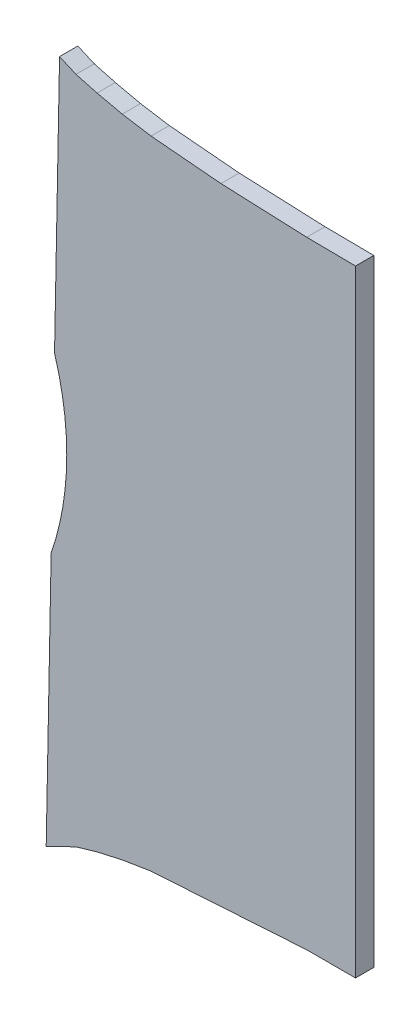
ISO-10303-21;
HEADER;
FILE_DESCRIPTION(('STEP AP214'),'2;1');
FILE_NAME('part.step','',(''),(''),'','','');
FILE_SCHEMA(('AUTOMOTIVE_DESIGN { 1 0 10303 214 1 1 1 1 }'));
ENDSEC;
DATA;
#1=APPLICATION_CONTEXT('core data for automotive mechanical design processes');
#2=APPLICATION_PROTOCOL_DEFINITION('international standard','automotive_design',2000,#1);
#3=PRODUCT_CONTEXT('',#1,'mechanical');
#4=PRODUCT('Part','Part','',(#3));
#5=PRODUCT_RELATED_PRODUCT_CATEGORY('part','',(#4));
#6=PRODUCT_DEFINITION_FORMATION('','',#4);
#7=PRODUCT_DEFINITION_CONTEXT('part definition',#1,'design');
#8=PRODUCT_DEFINITION('design','',#6,#7);
#9=PRODUCT_DEFINITION_SHAPE('','',#8);
#10=(LENGTH_UNIT() NAMED_UNIT(*) SI_UNIT(.MILLI.,.METRE.));
#11=(NAMED_UNIT(*) PLANE_ANGLE_UNIT() SI_UNIT($,.RADIAN.));
#12=(NAMED_UNIT(*) SI_UNIT($,.STERADIAN.) SOLID_ANGLE_UNIT());
#13=UNCERTAINTY_MEASURE_WITH_UNIT(LENGTH_MEASURE(1.E-05),#10,'distance_accuracy_value','');
#14=(GEOMETRIC_REPRESENTATION_CONTEXT(3) GLOBAL_UNCERTAINTY_ASSIGNED_CONTEXT((#13)) GLOBAL_UNIT_ASSIGNED_CONTEXT((#10,
#11,#12)) REPRESENTATION_CONTEXT('',''));
#15=CARTESIAN_POINT('',(0.,0.,0.));
#16=DIRECTION('',(0.,0.,1.));
#17=DIRECTION('',(1.,0.,0.));
#18=AXIS2_PLACEMENT_3D('',#15,#16,#17);
#19=CARTESIAN_POINT('',(86.8539962768555,56.6870002746582,0.));
#20=DIRECTION('',(-1.,0.,0.));
#21=DIRECTION('',(0.,1.,0.));
#22=AXIS2_PLACEMENT_3D('',#19,#20,#21);
#23=PLANE('',#22);
#24=DIRECTION('',(0.,1.,0.));
#25=VECTOR('',#24,1.);
#26=CARTESIAN_POINT('',(86.8539962768555,56.6870002746582,0.03556));
#27=LINE('',#26,#25);
#28=CARTESIAN_POINT('',(86.8539962768555,56.6870002746582,0.03556));
#29=VERTEX_POINT('',#28);
#30=CARTESIAN_POINT('',(86.8539962768555,57.8870010375977,0.03556));
#31=VERTEX_POINT('',#30);
#32=EDGE_CURVE('E11',#29,#31,#27,.T.);
#33=ORIENTED_EDGE('',*,*,#32,.F.);
#34=DIRECTION('',(0.,0.,1.));
#35=VECTOR('',#34,1.);
#36=CARTESIAN_POINT('',(86.8539962768555,56.6870002746582,0.));
#37=LINE('',#36,#35);
#38=CARTESIAN_POINT('',(86.8539962768555,56.6870002746582,0.));
#39=VERTEX_POINT('',#38);
#40=EDGE_CURVE('E24',#39,#29,#37,.T.);
#41=ORIENTED_EDGE('',*,*,#40,.F.);
#42=DIRECTION('',(0.,1.,0.));
#43=VECTOR('',#42,1.);
#44=CARTESIAN_POINT('',(86.8539962768555,56.6870002746582,0.));
#45=LINE('',#44,#43);
#46=CARTESIAN_POINT('',(86.8539962768555,57.8870010375977,0.));
#47=VERTEX_POINT('',#46);
#48=EDGE_CURVE('E281',#39,#47,#45,.T.);
#49=ORIENTED_EDGE('',*,*,#48,.T.);
#50=DIRECTION('',(0.,0.,1.));
#51=VECTOR('',#50,1.);
#52=CARTESIAN_POINT('',(86.8539962768555,57.8870010375977,0.));
#53=LINE('',#52,#51);
#54=EDGE_CURVE('E37',#47,#31,#53,.T.);
#55=ORIENTED_EDGE('',*,*,#54,.T.);
#56=EDGE_LOOP('',(#33,#41,#49,#55));
#57=FACE_BOUND('',#56,.T.);
#58=ADVANCED_FACE('F17',(#57),#23,.F.);
#59=CARTESIAN_POINT('',(86.7590026855469,56.6870002746582,0.));
#60=DIRECTION('',(0.,1.,0.));
#61=DIRECTION('',(1.,0.,0.));
#62=AXIS2_PLACEMENT_3D('',#59,#60,#61);
#63=PLANE('',#62);
#64=DIRECTION('',(1.,0.,0.));
#65=VECTOR('',#64,1.);
#66=CARTESIAN_POINT('',(86.7590026855469,56.6870002746582,0.03556));
#67=LINE('',#66,#65);
#68=CARTESIAN_POINT('',(86.7590026855469,56.6870002746582,0.03556));
#69=VERTEX_POINT('',#68);
#70=EDGE_CURVE('E277',#69,#29,#67,.T.);
#71=ORIENTED_EDGE('',*,*,#70,.F.);
#72=DIRECTION('',(0.,0.,1.));
#73=VECTOR('',#72,1.);
#74=CARTESIAN_POINT('',(86.7590026855469,56.6870002746582,0.));
#75=LINE('',#74,#73);
#76=CARTESIAN_POINT('',(86.7590026855469,56.6870002746582,0.));
#77=VERTEX_POINT('',#76);
#78=EDGE_CURVE('E275',#77,#69,#75,.T.);
#79=ORIENTED_EDGE('',*,*,#78,.F.);
#80=DIRECTION('',(1.,0.,0.));
#81=VECTOR('',#80,1.);
#82=CARTESIAN_POINT('',(86.7590026855469,56.6870002746582,0.));
#83=LINE('',#82,#81);
#84=EDGE_CURVE('E273',#77,#39,#83,.T.);
#85=ORIENTED_EDGE('',*,*,#84,.T.);
#86=ORIENTED_EDGE('',*,*,#40,.T.);
#87=EDGE_LOOP('',(#71,#79,#85,#86));
#88=FACE_BOUND('',#87,.T.);
#89=ADVANCED_FACE('F284',(#88),#63,.F.);
#90=CARTESIAN_POINT('',(86.4560012817383,56.6679992675781,0.));
#91=DIRECTION('',(-0.0625863654447241,0.998039551751542,0.));
#92=DIRECTION('',(0.998039551751542,0.0625863654447241,0.));
#93=AXIS2_PLACEMENT_3D('',#90,#91,#92);
#94=PLANE('',#93);
#95=DIRECTION('',(0.998039551751542,0.062586365444724,0.));
#96=VECTOR('',#95,1.);
#97=CARTESIAN_POINT('',(86.4560012817383,56.6679992675781,0.03556));
#98=LINE('',#97,#96);
#99=CARTESIAN_POINT('',(86.4560012817383,56.6679992675781,0.03556));
#100=VERTEX_POINT('',#99);
#101=EDGE_CURVE('E270',#100,#69,#98,.T.);
#102=ORIENTED_EDGE('',*,*,#101,.F.);
#103=DIRECTION('',(0.,0.,1.));
#104=VECTOR('',#103,1.);
#105=CARTESIAN_POINT('',(86.4560012817383,56.6679992675781,0.));
#106=LINE('',#105,#104);
#107=CARTESIAN_POINT('',(86.4560012817383,56.6679992675781,0.));
#108=VERTEX_POINT('',#107);
#109=EDGE_CURVE('E268',#108,#100,#106,.T.);
#110=ORIENTED_EDGE('',*,*,#109,.F.);
#111=DIRECTION('',(0.998039551751542,0.062586365444724,0.));
#112=VECTOR('',#111,1.);
#113=CARTESIAN_POINT('',(86.4560012817383,56.6679992675781,0.));
#114=LINE('',#113,#112);
#115=EDGE_CURVE('E265',#108,#77,#114,.T.);
#116=ORIENTED_EDGE('',*,*,#115,.T.);
#117=ORIENTED_EDGE('',*,*,#78,.T.);
#118=EDGE_LOOP('',(#102,#110,#116,#117));
#119=FACE_BOUND('',#118,.T.);
#120=ADVANCED_FACE('F287',(#119),#94,.F.);
#121=CARTESIAN_POINT('',(86.4000015258789,56.6590003967285,0.));
#122=DIRECTION('',(-0.158659362899509,0.98733338167223,0.));
#123=DIRECTION('',(0.98733338167223,0.158659362899509,0.));
#124=AXIS2_PLACEMENT_3D('',#121,#122,#123);
#125=PLANE('',#124);
#126=DIRECTION('',(0.98733338167223,0.158659362899509,0.));
#127=VECTOR('',#126,1.);
#128=CARTESIAN_POINT('',(86.4000015258789,56.6590003967285,0.03556));
#129=LINE('',#128,#127);
#130=CARTESIAN_POINT('',(86.4000015258789,56.6590003967285,0.03556));
#131=VERTEX_POINT('',#130);
#132=EDGE_CURVE('E262',#131,#100,#129,.T.);
#133=ORIENTED_EDGE('',*,*,#132,.F.);
#134=DIRECTION('',(0.,0.,1.));
#135=VECTOR('',#134,1.);
#136=CARTESIAN_POINT('',(86.4000015258789,56.6590003967285,0.));
#137=LINE('',#136,#135);
#138=CARTESIAN_POINT('',(86.4000015258789,56.6590003967285,0.));
#139=VERTEX_POINT('',#138);
#140=EDGE_CURVE('E260',#139,#131,#137,.T.);
#141=ORIENTED_EDGE('',*,*,#140,.F.);
#142=DIRECTION('',(0.98733338167223,0.158659362899509,0.));
#143=VECTOR('',#142,1.);
#144=CARTESIAN_POINT('',(86.4000015258789,56.6590003967285,0.));
#145=LINE('',#144,#143);
#146=EDGE_CURVE('E257',#139,#108,#145,.T.);
#147=ORIENTED_EDGE('',*,*,#146,.T.);
#148=ORIENTED_EDGE('',*,*,#109,.T.);
#149=EDGE_LOOP('',(#133,#141,#147,#148));
#150=FACE_BOUND('',#149,.T.);
#151=ADVANCED_FACE('F292',(#150),#125,.F.);
#152=CARTESIAN_POINT('',(86.3509979248047,56.6479988098145,0.));
#153=DIRECTION('',(-0.219053099521805,0.975712939132146,0.));
#154=DIRECTION('',(0.975712939132146,0.219053099521805,0.));
#155=AXIS2_PLACEMENT_3D('',#152,#153,#154);
#156=PLANE('',#155);
#157=DIRECTION('',(0.975712939132146,0.219053099521805,0.));
#158=VECTOR('',#157,1.);
#159=CARTESIAN_POINT('',(86.3509979248047,56.6479988098145,0.03556));
#160=LINE('',#159,#158);
#161=CARTESIAN_POINT('',(86.3509979248047,56.6479988098145,0.03556));
#162=VERTEX_POINT('',#161);
#163=EDGE_CURVE('E254',#162,#131,#160,.T.);
#164=ORIENTED_EDGE('',*,*,#163,.F.);
#165=DIRECTION('',(0.,0.,1.));
#166=VECTOR('',#165,1.);
#167=CARTESIAN_POINT('',(86.3509979248047,56.6479988098145,0.));
#168=LINE('',#167,#166);
#169=CARTESIAN_POINT('',(86.3509979248047,56.6479988098145,0.));
#170=VERTEX_POINT('',#169);
#171=EDGE_CURVE('E252',#170,#162,#168,.T.);
#172=ORIENTED_EDGE('',*,*,#171,.F.);
#173=DIRECTION('',(0.975712939132146,0.219053099521805,0.));
#174=VECTOR('',#173,1.);
#175=CARTESIAN_POINT('',(86.3509979248047,56.6479988098145,0.));
#176=LINE('',#175,#174);
#177=EDGE_CURVE('E249',#170,#139,#176,.T.);
#178=ORIENTED_EDGE('',*,*,#177,.T.);
#179=ORIENTED_EDGE('',*,*,#140,.T.);
#180=EDGE_LOOP('',(#164,#172,#178,#179));
#181=FACE_BOUND('',#180,.T.);
#182=ADVANCED_FACE('F295',(#181),#156,.F.);
#183=CARTESIAN_POINT('',(86.3099975585938,56.6360015869141,0.));
#184=DIRECTION('',(-0.280836563379069,0.959755606740296,0.));
#185=DIRECTION('',(0.959755606740296,0.280836563379069,0.));
#186=AXIS2_PLACEMENT_3D('',#183,#184,#185);
#187=PLANE('',#186);
#188=DIRECTION('',(0.959755606740296,0.280836563379069,0.));
#189=VECTOR('',#188,1.);
#190=CARTESIAN_POINT('',(86.3099975585938,56.6360015869141,0.03556));
#191=LINE('',#190,#189);
#192=CARTESIAN_POINT('',(86.3099975585938,56.6360015869141,0.03556));
#193=VERTEX_POINT('',#192);
#194=EDGE_CURVE('E246',#193,#162,#191,.T.);
#195=ORIENTED_EDGE('',*,*,#194,.F.);
#196=DIRECTION('',(0.,0.,1.));
#197=VECTOR('',#196,1.);
#198=CARTESIAN_POINT('',(86.3099975585938,56.6360015869141,0.));
#199=LINE('',#198,#197);
#200=CARTESIAN_POINT('',(86.3099975585938,56.6360015869141,0.));
#201=VERTEX_POINT('',#200);
#202=EDGE_CURVE('E244',#201,#193,#199,.T.);
#203=ORIENTED_EDGE('',*,*,#202,.F.);
#204=DIRECTION('',(0.959755606740296,0.280836563379069,0.));
#205=VECTOR('',#204,1.);
#206=CARTESIAN_POINT('',(86.3099975585938,56.6360015869141,0.));
#207=LINE('',#206,#205);
#208=EDGE_CURVE('E241',#201,#170,#207,.T.);
#209=ORIENTED_EDGE('',*,*,#208,.T.);
#210=ORIENTED_EDGE('',*,*,#171,.T.);
#211=EDGE_LOOP('',(#195,#203,#209,#210));
#212=FACE_BOUND('',#211,.T.);
#213=ADVANCED_FACE('F300',(#212),#187,.F.);
#214=CARTESIAN_POINT('',(86.2519989013672,56.6080017089844,0.));
#215=DIRECTION('',(-0.434755691468777,0.900548437750855,0.));
#216=DIRECTION('',(0.900548437750855,0.434755691468777,0.));
#217=AXIS2_PLACEMENT_3D('',#214,#215,#216);
#218=PLANE('',#217);
#219=DIRECTION('',(0.900548437750855,0.434755691468777,0.));
#220=VECTOR('',#219,1.);
#221=CARTESIAN_POINT('',(86.2519989013672,56.6080017089844,0.03556));
#222=LINE('',#221,#220);
#223=CARTESIAN_POINT('',(86.2519989013672,56.6080017089844,0.03556));
#224=VERTEX_POINT('',#223);
#225=EDGE_CURVE('E238',#224,#193,#222,.T.);
#226=ORIENTED_EDGE('',*,*,#225,.F.);
#227=DIRECTION('',(0.,0.,1.));
#228=VECTOR('',#227,1.);
#229=CARTESIAN_POINT('',(86.2519989013672,56.6080017089844,0.));
#230=LINE('',#229,#228);
#231=CARTESIAN_POINT('',(86.2519989013672,56.6080017089844,0.));
#232=VERTEX_POINT('',#231);
#233=EDGE_CURVE('E236',#232,#224,#230,.T.);
#234=ORIENTED_EDGE('',*,*,#233,.F.);
#235=DIRECTION('',(0.900548437750855,0.434755691468777,0.));
#236=VECTOR('',#235,1.);
#237=CARTESIAN_POINT('',(86.2519989013672,56.6080017089844,0.));
#238=LINE('',#237,#236);
#239=EDGE_CURVE('E233',#232,#201,#238,.T.);
#240=ORIENTED_EDGE('',*,*,#239,.T.);
#241=ORIENTED_EDGE('',*,*,#202,.T.);
#242=EDGE_LOOP('',(#226,#234,#240,#241));
#243=FACE_BOUND('',#242,.T.);
#244=ADVANCED_FACE('F303',(#243),#218,.F.);
#245=CARTESIAN_POINT('',(86.2616575630483,57.1072607087142,0.));
#246=DIRECTION('',(0.999812918767624,-0.0193423748636048,0.));
#247=DIRECTION('',(-0.0193423748636048,-0.999812918767624,0.));
#248=AXIS2_PLACEMENT_3D('',#245,#246,#247);
#249=PLANE('',#248);
#250=DIRECTION('',(-0.0193423748636048,-0.999812918767624,0.));
#251=VECTOR('',#250,1.);
#252=CARTESIAN_POINT('',(86.2779998779297,57.9519996643066,0.03556));
#253=LINE('',#252,#251);
#254=CARTESIAN_POINT('',(86.2616575630483,57.1072607087142,0.03556));
#255=VERTEX_POINT('',#254);
#256=EDGE_CURVE('E230',#255,#224,#253,.T.);
#257=ORIENTED_EDGE('',*,*,#256,.F.);
#258=DIRECTION('',(0.,0.,1.));
#259=VECTOR('',#258,1.);
#260=CARTESIAN_POINT('',(86.2616575630483,57.1072607087142,0.));
#261=LINE('',#260,#259);
#262=CARTESIAN_POINT('',(86.2616575630483,57.1072607087142,0.));
#263=VERTEX_POINT('',#262);
#264=EDGE_CURVE('E228',#263,#255,#261,.T.);
#265=ORIENTED_EDGE('',*,*,#264,.F.);
#266=DIRECTION('',(-0.0193423748636048,-0.999812918767624,0.));
#267=VECTOR('',#266,1.);
#268=CARTESIAN_POINT('',(86.2779998779297,57.9519996643066,0.));
#269=LINE('',#268,#267);
#270=EDGE_CURVE('E225',#263,#232,#269,.T.);
#271=ORIENTED_EDGE('',*,*,#270,.T.);
#272=ORIENTED_EDGE('',*,*,#233,.T.);
#273=EDGE_LOOP('',(#257,#265,#271,#272));
#274=FACE_BOUND('',#273,.T.);
#275=ADVANCED_FACE('F308',(#274),#249,.F.);
#276=CARTESIAN_POINT('',(85.742018,57.2874648,0.));
#277=DIRECTION('',(0.,0.,-1.));
#278=DIRECTION('',(1.,0.,0.));
#279=AXIS2_PLACEMENT_3D('',#276,#277,#278);
#280=CYLINDRICAL_SURFACE('',#279,0.5499989);
#281=ORIENTED_EDGE('',*,*,#264,.T.);
#282=CARTESIAN_POINT('',(85.742018,57.2874648,0.03556));
#283=DIRECTION('',(0.,0.,1.));
#284=DIRECTION('',(1.,0.,0.));
#285=AXIS2_PLACEMENT_3D('',#282,#283,#284);
#286=CIRCLE('',#285,0.5499989);
#287=CARTESIAN_POINT('',(86.2920169,57.2874648,0.03556));
#288=VERTEX_POINT('',#287);
#289=EDGE_CURVE('E222',#255,#288,#286,.T.);
#290=ORIENTED_EDGE('',*,*,#289,.T.);
#291=DIRECTION('',(0.,0.,1.));
#292=VECTOR('',#291,1.);
#293=CARTESIAN_POINT('',(86.2920169,57.2874648,0.));
#294=LINE('',#293,#292);
#295=CARTESIAN_POINT('',(86.2920169,57.2874648,0.));
#296=VERTEX_POINT('',#295);
#297=EDGE_CURVE('E220',#296,#288,#294,.T.);
#298=ORIENTED_EDGE('',*,*,#297,.F.);
#299=CARTESIAN_POINT('',(85.742018,57.2874648,0.));
#300=DIRECTION('',(0.,0.,1.));
#301=DIRECTION('',(1.,0.,0.));
#302=AXIS2_PLACEMENT_3D('',#299,#300,#301);
#303=CIRCLE('',#302,0.5499989);
#304=EDGE_CURVE('E217',#263,#296,#303,.T.);
#305=ORIENTED_EDGE('',*,*,#304,.F.);
#306=EDGE_LOOP('',(#281,#290,#298,#305));
#307=FACE_BOUND('',#306,.T.);
#308=ADVANCED_FACE('F311',(#307),#280,.F.);
#309=CARTESIAN_POINT('',(85.742018,57.2874648,0.));
#310=DIRECTION('',(0.,0.,-1.));
#311=DIRECTION('',(1.,0.,0.));
#312=AXIS2_PLACEMENT_3D('',#309,#310,#311);
#313=CYLINDRICAL_SURFACE('',#312,0.5499989);
#314=ORIENTED_EDGE('',*,*,#297,.T.);
#315=CARTESIAN_POINT('',(85.742018,57.2874648,0.03556));
#316=DIRECTION('',(0.,0.,1.));
#317=DIRECTION('',(1.,0.,0.));
#318=AXIS2_PLACEMENT_3D('',#315,#316,#317);
#319=CIRCLE('',#318,0.5499989);
#320=CARTESIAN_POINT('',(86.2682385861829,57.4474356869717,0.03556));
#321=VERTEX_POINT('',#320);
#322=EDGE_CURVE('E214',#288,#321,#319,.T.);
#323=ORIENTED_EDGE('',*,*,#322,.T.);
#324=DIRECTION('',(0.,0.,1.));
#325=VECTOR('',#324,1.);
#326=CARTESIAN_POINT('',(86.2682385861829,57.4474356869717,0.));
#327=LINE('',#326,#325);
#328=CARTESIAN_POINT('',(86.2682385861829,57.4474356869717,0.));
#329=VERTEX_POINT('',#328);
#330=EDGE_CURVE('E212',#329,#321,#327,.T.);
#331=ORIENTED_EDGE('',*,*,#330,.F.);
#332=EDGE_CURVE('E211',#296,#329,#303,.T.);
#333=ORIENTED_EDGE('',*,*,#332,.F.);
#334=EDGE_LOOP('',(#314,#323,#331,#333));
#335=FACE_BOUND('',#334,.T.);
#336=ADVANCED_FACE('F318',(#335),#313,.F.);
#337=CARTESIAN_POINT('',(86.2779998779297,57.9519996643066,0.));
#338=DIRECTION('',(0.999812918767624,-0.0193423748636048,0.));
#339=DIRECTION('',(-0.0193423748636048,-0.999812918767624,0.));
#340=AXIS2_PLACEMENT_3D('',#337,#338,#339);
#341=PLANE('',#340);
#342=DIRECTION('',(-0.0193423748636048,-0.999812918767624,0.));
#343=VECTOR('',#342,1.);
#344=CARTESIAN_POINT('',(86.2779998779297,57.9519996643066,0.03556));
#345=LINE('',#344,#343);
#346=CARTESIAN_POINT('',(86.2779998779297,57.9519996643066,0.03556));
#347=VERTEX_POINT('',#346);
#348=EDGE_CURVE('E208',#347,#321,#345,.T.);
#349=ORIENTED_EDGE('',*,*,#348,.F.);
#350=DIRECTION('',(0.,0.,1.));
#351=VECTOR('',#350,1.);
#352=CARTESIAN_POINT('',(86.2779998779297,57.9519996643066,0.));
#353=LINE('',#352,#351);
#354=CARTESIAN_POINT('',(86.2779998779297,57.9519996643066,0.));
#355=VERTEX_POINT('',#354);
#356=EDGE_CURVE('E206',#355,#347,#353,.T.);
#357=ORIENTED_EDGE('',*,*,#356,.F.);
#358=EDGE_CURVE('E205',#355,#329,#269,.T.);
#359=ORIENTED_EDGE('',*,*,#358,.T.);
#360=ORIENTED_EDGE('',*,*,#330,.T.);
#361=EDGE_LOOP('',(#349,#357,#359,#360));
#362=FACE_BOUND('',#361,.T.);
#363=ADVANCED_FACE('F321',(#362),#341,.F.);
#364=CARTESIAN_POINT('',(86.3099975585938,57.9379997253418,0.));
#365=DIRECTION('',(-0.400841752438229,-0.916147307752552,0.));
#366=DIRECTION('',(-0.916147307752552,0.400841752438229,0.));
#367=AXIS2_PLACEMENT_3D('',#364,#365,#366);
#368=PLANE('',#367);
#369=DIRECTION('',(-0.916147307752552,0.400841752438229,0.));
#370=VECTOR('',#369,1.);
#371=CARTESIAN_POINT('',(86.3099975585938,57.9379997253418,0.03556));
#372=LINE('',#371,#370);
#373=CARTESIAN_POINT('',(86.3099975585938,57.9379997253418,0.03556));
#374=VERTEX_POINT('',#373);
#375=EDGE_CURVE('E202',#374,#347,#372,.T.);
#376=ORIENTED_EDGE('',*,*,#375,.F.);
#377=DIRECTION('',(0.,0.,1.));
#378=VECTOR('',#377,1.);
#379=CARTESIAN_POINT('',(86.3099975585938,57.9379997253418,0.));
#380=LINE('',#379,#378);
#381=CARTESIAN_POINT('',(86.3099975585938,57.9379997253418,0.));
#382=VERTEX_POINT('',#381);
#383=EDGE_CURVE('E200',#382,#374,#380,.T.);
#384=ORIENTED_EDGE('',*,*,#383,.F.);
#385=DIRECTION('',(-0.916147307752552,0.400841752438229,0.));
#386=VECTOR('',#385,1.);
#387=CARTESIAN_POINT('',(86.3099975585938,57.9379997253418,0.));
#388=LINE('',#387,#386);
#389=EDGE_CURVE('E197',#382,#355,#388,.T.);
#390=ORIENTED_EDGE('',*,*,#389,.T.);
#391=ORIENTED_EDGE('',*,*,#356,.T.);
#392=EDGE_LOOP('',(#376,#384,#390,#391));
#393=FACE_BOUND('',#392,.T.);
#394=ADVANCED_FACE('F326',(#393),#368,.F.);
#395=CARTESIAN_POINT('',(86.3509979248047,57.9269981384277,0.));
#396=DIRECTION('',(-0.259161279205212,-0.96583405995063,0.));
#397=DIRECTION('',(-0.96583405995063,0.259161279205212,0.));
#398=AXIS2_PLACEMENT_3D('',#395,#396,#397);
#399=PLANE('',#398);
#400=DIRECTION('',(-0.96583405995063,0.259161279205212,0.));
#401=VECTOR('',#400,1.);
#402=CARTESIAN_POINT('',(86.3509979248047,57.9269981384277,0.03556));
#403=LINE('',#402,#401);
#404=CARTESIAN_POINT('',(86.3509979248047,57.9269981384277,0.03556));
#405=VERTEX_POINT('',#404);
#406=EDGE_CURVE('E194',#405,#374,#403,.T.);
#407=ORIENTED_EDGE('',*,*,#406,.F.);
#408=DIRECTION('',(0.,0.,1.));
#409=VECTOR('',#408,1.);
#410=CARTESIAN_POINT('',(86.3509979248047,57.9269981384277,0.));
#411=LINE('',#410,#409);
#412=CARTESIAN_POINT('',(86.3509979248047,57.9269981384277,0.));
#413=VERTEX_POINT('',#412);
#414=EDGE_CURVE('E192',#413,#405,#411,.T.);
#415=ORIENTED_EDGE('',*,*,#414,.F.);
#416=DIRECTION('',(-0.96583405995063,0.259161279205212,0.));
#417=VECTOR('',#416,1.);
#418=CARTESIAN_POINT('',(86.3509979248047,57.9269981384277,0.));
#419=LINE('',#418,#417);
#420=EDGE_CURVE('E189',#413,#382,#419,.T.);
#421=ORIENTED_EDGE('',*,*,#420,.T.);
#422=ORIENTED_EDGE('',*,*,#383,.T.);
#423=EDGE_LOOP('',(#407,#415,#421,#422));
#424=FACE_BOUND('',#423,.T.);
#425=ADVANCED_FACE('F329',(#424),#399,.F.);
#426=CARTESIAN_POINT('',(86.4000015258789,57.9160003662109,0.));
#427=DIRECTION('',(-0.218980787731685,-0.975729170725366,0.));
#428=DIRECTION('',(-0.975729170725366,0.218980787731685,0.));
#429=AXIS2_PLACEMENT_3D('',#426,#427,#428);
#430=PLANE('',#429);
#431=DIRECTION('',(-0.975729170725366,0.218980787731685,0.));
#432=VECTOR('',#431,1.);
#433=CARTESIAN_POINT('',(86.4000015258789,57.9160003662109,0.03556));
#434=LINE('',#433,#432);
#435=CARTESIAN_POINT('',(86.4000015258789,57.9160003662109,0.03556));
#436=VERTEX_POINT('',#435);
#437=EDGE_CURVE('E186',#436,#405,#434,.T.);
#438=ORIENTED_EDGE('',*,*,#437,.F.);
#439=DIRECTION('',(0.,0.,1.));
#440=VECTOR('',#439,1.);
#441=CARTESIAN_POINT('',(86.4000015258789,57.9160003662109,0.));
#442=LINE('',#441,#440);
#443=CARTESIAN_POINT('',(86.4000015258789,57.9160003662109,0.));
#444=VERTEX_POINT('',#443);
#445=EDGE_CURVE('E184',#444,#436,#442,.T.);
#446=ORIENTED_EDGE('',*,*,#445,.F.);
#447=DIRECTION('',(-0.975729170725366,0.218980787731685,0.));
#448=VECTOR('',#447,1.);
#449=CARTESIAN_POINT('',(86.4000015258789,57.9160003662109,0.));
#450=LINE('',#449,#448);
#451=EDGE_CURVE('E181',#444,#413,#450,.T.);
#452=ORIENTED_EDGE('',*,*,#451,.T.);
#453=ORIENTED_EDGE('',*,*,#414,.T.);
#454=EDGE_LOOP('',(#438,#446,#452,#453));
#455=FACE_BOUND('',#454,.T.);
#456=ADVANCED_FACE('F333',(#455),#430,.F.);
#457=CARTESIAN_POINT('',(86.4560012817383,57.9070014953613,0.));
#458=DIRECTION('',(-0.158659362899509,-0.98733338167223,0.));
#459=DIRECTION('',(-0.98733338167223,0.158659362899509,0.));
#460=AXIS2_PLACEMENT_3D('',#457,#458,#459);
#461=PLANE('',#460);
#462=DIRECTION('',(-0.98733338167223,0.158659362899509,0.));
#463=VECTOR('',#462,1.);
#464=CARTESIAN_POINT('',(86.4560012817383,57.9070014953613,0.03556));
#465=LINE('',#464,#463);
#466=CARTESIAN_POINT('',(86.4560012817383,57.9070014953613,0.03556));
#467=VERTEX_POINT('',#466);
#468=EDGE_CURVE('E178',#467,#436,#465,.T.);
#469=ORIENTED_EDGE('',*,*,#468,.F.);
#470=DIRECTION('',(0.,0.,1.));
#471=VECTOR('',#470,1.);
#472=CARTESIAN_POINT('',(86.4560012817383,57.9070014953613,0.));
#473=LINE('',#472,#471);
#474=CARTESIAN_POINT('',(86.4560012817383,57.9070014953613,0.));
#475=VERTEX_POINT('',#474);
#476=EDGE_CURVE('E176',#475,#467,#473,.T.);
#477=ORIENTED_EDGE('',*,*,#476,.F.);
#478=DIRECTION('',(-0.98733338167223,0.158659362899509,0.));
#479=VECTOR('',#478,1.);
#480=CARTESIAN_POINT('',(86.4560012817383,57.9070014953613,0.));
#481=LINE('',#480,#479);
#482=EDGE_CURVE('E173',#475,#444,#481,.T.);
#483=ORIENTED_EDGE('',*,*,#482,.T.);
#484=ORIENTED_EDGE('',*,*,#445,.T.);
#485=EDGE_LOOP('',(#469,#477,#483,#484));
#486=FACE_BOUND('',#485,.T.);
#487=ADVANCED_FACE('F336',(#486),#461,.F.);
#488=CARTESIAN_POINT('',(86.5920028686523,57.8950004577637,0.));
#489=DIRECTION('',(-0.0879003337061126,-0.996129274408876,0.));
#490=DIRECTION('',(-0.996129274408876,0.0879003337061126,0.));
#491=AXIS2_PLACEMENT_3D('',#488,#489,#490);
#492=PLANE('',#491);
#493=DIRECTION('',(-0.996129274408876,0.0879003337061126,0.));
#494=VECTOR('',#493,1.);
#495=CARTESIAN_POINT('',(86.5920028686523,57.8950004577637,0.03556));
#496=LINE('',#495,#494);
#497=CARTESIAN_POINT('',(86.5920028686523,57.8950004577637,0.03556));
#498=VERTEX_POINT('',#497);
#499=EDGE_CURVE('E170',#498,#467,#496,.T.);
#500=ORIENTED_EDGE('',*,*,#499,.F.);
#501=DIRECTION('',(0.,0.,1.));
#502=VECTOR('',#501,1.);
#503=CARTESIAN_POINT('',(86.5920028686523,57.8950004577637,0.));
#504=LINE('',#503,#502);
#505=CARTESIAN_POINT('',(86.5920028686523,57.8950004577637,0.));
#506=VERTEX_POINT('',#505);
#507=EDGE_CURVE('E168',#506,#498,#504,.T.);
#508=ORIENTED_EDGE('',*,*,#507,.F.);
#509=DIRECTION('',(-0.996129274408876,0.0879003337061126,0.));
#510=VECTOR('',#509,1.);
#511=CARTESIAN_POINT('',(86.5920028686523,57.8950004577637,0.));
#512=LINE('',#511,#510);
#513=EDGE_CURVE('E159',#506,#475,#512,.T.);
#514=ORIENTED_EDGE('',*,*,#513,.T.);
#515=ORIENTED_EDGE('',*,*,#476,.T.);
#516=EDGE_LOOP('',(#500,#508,#514,#515));
#517=FACE_BOUND('',#516,.T.);
#518=ADVANCED_FACE('F339',(#517),#492,.F.);
#519=CARTESIAN_POINT('',(86.7590026855469,57.8880004882812,0.));
#520=DIRECTION('',(-0.0418792570717929,-0.999122679067548,0.));
#521=DIRECTION('',(-0.999122679067548,0.0418792570717929,0.));
#522=AXIS2_PLACEMENT_3D('',#519,#520,#521);
#523=PLANE('',#522);
#524=DIRECTION('',(-0.999122679067548,0.0418792570717929,0.));
#525=VECTOR('',#524,1.);
#526=CARTESIAN_POINT('',(86.7590026855469,57.8880004882812,0.03556));
#527=LINE('',#526,#525);
#528=CARTESIAN_POINT('',(86.7590026855469,57.8880004882812,0.03556));
#529=VERTEX_POINT('',#528);
#530=EDGE_CURVE('E145',#529,#498,#527,.T.);
#531=ORIENTED_EDGE('',*,*,#530,.F.);
#532=DIRECTION('',(0.,0.,1.));
#533=VECTOR('',#532,1.);
#534=CARTESIAN_POINT('',(86.7590026855469,57.8880004882812,0.));
#535=LINE('',#534,#533);
#536=CARTESIAN_POINT('',(86.7590026855469,57.8880004882812,0.));
#537=VERTEX_POINT('',#536);
#538=EDGE_CURVE('E140',#537,#529,#535,.T.);
#539=ORIENTED_EDGE('',*,*,#538,.F.);
#540=DIRECTION('',(-0.999122679067548,0.0418792570717929,0.));
#541=VECTOR('',#540,1.);
#542=CARTESIAN_POINT('',(86.7590026855469,57.8880004882812,0.));
#543=LINE('',#542,#541);
#544=EDGE_CURVE('E143',#537,#506,#543,.T.);
#545=ORIENTED_EDGE('',*,*,#544,.T.);
#546=ORIENTED_EDGE('',*,*,#507,.T.);
#547=EDGE_LOOP('',(#531,#539,#545,#546));
#548=FACE_BOUND('',#547,.T.);
#549=ADVANCED_FACE('F142',(#548),#523,.F.);
#550=CARTESIAN_POINT('',(86.8539962768555,57.8870010375977,0.));
#551=DIRECTION('',(-0.0105206609892561,-0.999944656314713,0.));
#552=DIRECTION('',(-0.999944656314713,0.0105206609892561,0.));
#553=AXIS2_PLACEMENT_3D('',#550,#551,#552);
#554=PLANE('',#553);
#555=DIRECTION('',(-0.999944656314713,0.0105206609892561,0.));
#556=VECTOR('',#555,1.);
#557=CARTESIAN_POINT('',(86.8539962768555,57.8870010375977,0.03556));
#558=LINE('',#557,#556);
#559=EDGE_CURVE('E160',#31,#529,#558,.T.);
#560=ORIENTED_EDGE('',*,*,#559,.F.);
#561=ORIENTED_EDGE('',*,*,#54,.F.);
#562=DIRECTION('',(-0.999944656314713,0.0105206609892561,0.));
#563=VECTOR('',#562,1.);
#564=CARTESIAN_POINT('',(86.8539962768555,57.8870010375977,0.));
#565=LINE('',#564,#563);
#566=EDGE_CURVE('E156',#47,#537,#565,.T.);
#567=ORIENTED_EDGE('',*,*,#566,.T.);
#568=ORIENTED_EDGE('',*,*,#538,.T.);
#569=EDGE_LOOP('',(#560,#561,#567,#568));
#570=FACE_BOUND('',#569,.T.);
#571=ADVANCED_FACE('F162',(#570),#554,.F.);
#572=CARTESIAN_POINT('',(86.8539962768555,57.8870010375977,0.));
#573=DIRECTION('',(0.,0.,1.));
#574=DIRECTION('',(1.,0.,0.));
#575=AXIS2_PLACEMENT_3D('',#572,#573,#574);
#576=PLANE('',#575);
#577=ORIENTED_EDGE('',*,*,#566,.F.);
#578=ORIENTED_EDGE('',*,*,#48,.F.);
#579=ORIENTED_EDGE('',*,*,#84,.F.);
#580=ORIENTED_EDGE('',*,*,#115,.F.);
#581=ORIENTED_EDGE('',*,*,#146,.F.);
#582=ORIENTED_EDGE('',*,*,#177,.F.);
#583=ORIENTED_EDGE('',*,*,#208,.F.);
#584=ORIENTED_EDGE('',*,*,#239,.F.);
#585=ORIENTED_EDGE('',*,*,#270,.F.);
#586=ORIENTED_EDGE('',*,*,#304,.T.);
#587=ORIENTED_EDGE('',*,*,#332,.T.);
#588=ORIENTED_EDGE('',*,*,#358,.F.);
#589=ORIENTED_EDGE('',*,*,#389,.F.);
#590=ORIENTED_EDGE('',*,*,#420,.F.);
#591=ORIENTED_EDGE('',*,*,#451,.F.);
#592=ORIENTED_EDGE('',*,*,#482,.F.);
#593=ORIENTED_EDGE('',*,*,#513,.F.);
#594=ORIENTED_EDGE('',*,*,#544,.F.);
#595=EDGE_LOOP('',(#577,#578,#579,#580,#581,#582,#583,#584,#585,#586,#587,#588,#589,#590,#591,
#592,#593,#594));
#596=FACE_BOUND('',#595,.T.);
#597=ADVANCED_FACE('F154',(#596),#576,.F.);
#598=CARTESIAN_POINT('',(86.8539962768555,57.8870010375977,0.03556));
#599=DIRECTION('',(0.,0.,1.));
#600=DIRECTION('',(1.,0.,0.));
#601=AXIS2_PLACEMENT_3D('',#598,#599,#600);
#602=PLANE('',#601);
#603=ORIENTED_EDGE('',*,*,#32,.T.);
#604=ORIENTED_EDGE('',*,*,#559,.T.);
#605=ORIENTED_EDGE('',*,*,#530,.T.);
#606=ORIENTED_EDGE('',*,*,#499,.T.);
#607=ORIENTED_EDGE('',*,*,#468,.T.);
#608=ORIENTED_EDGE('',*,*,#437,.T.);
#609=ORIENTED_EDGE('',*,*,#406,.T.);
#610=ORIENTED_EDGE('',*,*,#375,.T.);
#611=ORIENTED_EDGE('',*,*,#348,.T.);
#612=ORIENTED_EDGE('',*,*,#322,.F.);
#613=ORIENTED_EDGE('',*,*,#289,.F.);
#614=ORIENTED_EDGE('',*,*,#256,.T.);
#615=ORIENTED_EDGE('',*,*,#225,.T.);
#616=ORIENTED_EDGE('',*,*,#194,.T.);
#617=ORIENTED_EDGE('',*,*,#163,.T.);
#618=ORIENTED_EDGE('',*,*,#132,.T.);
#619=ORIENTED_EDGE('',*,*,#101,.T.);
#620=ORIENTED_EDGE('',*,*,#70,.T.);
#621=EDGE_LOOP('',(#603,#604,#605,#606,#607,#608,#609,#610,#611,#612,#613,#614,#615,#616,#617,
#618,#619,#620));
#622=FACE_BOUND('',#621,.T.);
#623=ADVANCED_FACE('F341',(#622),#602,.T.);
#624=CLOSED_SHELL('',(#58,#89,#120,#151,#182,#213,#244,#275,#308,#336,#363,#394,#425,#456,#487,
#518,#549,#571,#597,#623));
#625=MANIFOLD_SOLID_BREP('B1',#624);
#626=ADVANCED_BREP_SHAPE_REPRESENTATION('',(#18,#625),#14);
#627=SHAPE_DEFINITION_REPRESENTATION(#9,#626);
ENDSEC;
END-ISO-10303-21;
